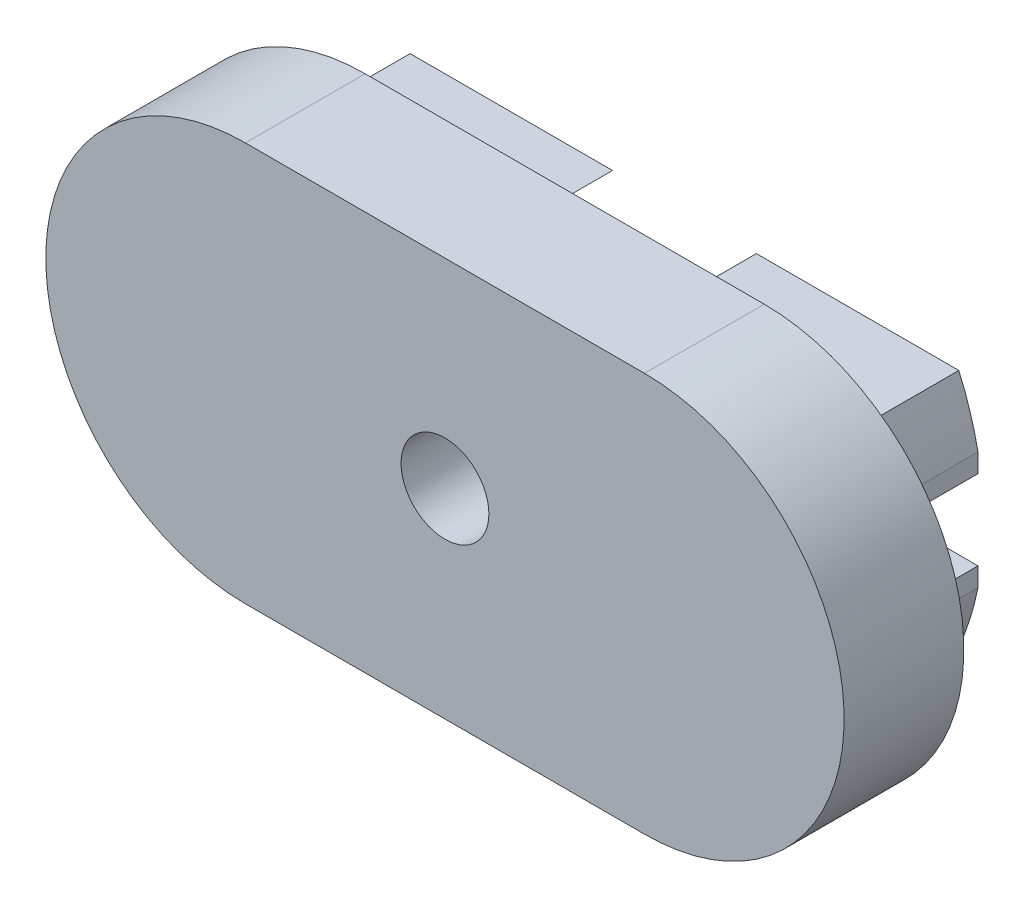
ISO-10303-21;
HEADER;
FILE_DESCRIPTION(('STEP AP214'),'2;1');
FILE_NAME('part.step','',(''),(''),'','','');
FILE_SCHEMA(('AUTOMOTIVE_DESIGN { 1 0 10303 214 1 1 1 1 }'));
ENDSEC;
DATA;
#1=APPLICATION_CONTEXT('core data for automotive mechanical design processes');
#2=APPLICATION_PROTOCOL_DEFINITION('international standard','automotive_design',2000,#1);
#3=PRODUCT_CONTEXT('',#1,'mechanical');
#4=PRODUCT('Part','Part','',(#3));
#5=PRODUCT_RELATED_PRODUCT_CATEGORY('part','',(#4));
#6=PRODUCT_DEFINITION_FORMATION('','',#4);
#7=PRODUCT_DEFINITION_CONTEXT('part definition',#1,'design');
#8=PRODUCT_DEFINITION('design','',#6,#7);
#9=PRODUCT_DEFINITION_SHAPE('','',#8);
#10=(LENGTH_UNIT() NAMED_UNIT(*) SI_UNIT(.MILLI.,.METRE.));
#11=(NAMED_UNIT(*) PLANE_ANGLE_UNIT() SI_UNIT($,.RADIAN.));
#12=(NAMED_UNIT(*) SI_UNIT($,.STERADIAN.) SOLID_ANGLE_UNIT());
#13=UNCERTAINTY_MEASURE_WITH_UNIT(LENGTH_MEASURE(1.E-05),#10,'distance_accuracy_value','');
#14=(GEOMETRIC_REPRESENTATION_CONTEXT(3) GLOBAL_UNCERTAINTY_ASSIGNED_CONTEXT((#13)) GLOBAL_UNIT_ASSIGNED_CONTEXT((#10,
#11,#12)) REPRESENTATION_CONTEXT('',''));
#15=CARTESIAN_POINT('',(0.,0.,0.));
#16=DIRECTION('',(0.,0.,1.));
#17=DIRECTION('',(1.,0.,0.));
#18=AXIS2_PLACEMENT_3D('',#15,#16,#17);
#19=CARTESIAN_POINT('',(-5.,0.,0.));
#20=DIRECTION('',(0.,0.,1.));
#21=DIRECTION('',(1.,0.,0.));
#22=AXIS2_PLACEMENT_3D('',#19,#20,#21);
#23=PLANE('',#22);
#24=CARTESIAN_POINT('',(0.,0.,0.));
#25=DIRECTION('',(0.,0.,-1.));
#26=DIRECTION('',(-1.,0.,0.));
#27=AXIS2_PLACEMENT_3D('',#24,#25,#26);
#28=CIRCLE('',#27,7.5);
#29=CARTESIAN_POINT('',(-7.35410196624968,1.47213595499958,0.));
#30=VERTEX_POINT('',#29);
#31=CARTESIAN_POINT('',(-6.87386354243376,3.,0.));
#32=VERTEX_POINT('',#31);
#33=EDGE_CURVE('E264',#30,#32,#28,.T.);
#34=ORIENTED_EDGE('',*,*,#33,.F.);
#35=DIRECTION('',(0.,1.,0.));
#36=VECTOR('',#35,1.);
#37=CARTESIAN_POINT('',(-7.35410196624968,1.47213595499958,0.));
#38=LINE('',#37,#36);
#39=CARTESIAN_POINT('',(-7.35410196624968,1.,0.));
#40=VERTEX_POINT('',#39);
#41=EDGE_CURVE('E251',#40,#30,#38,.T.);
#42=ORIENTED_EDGE('',*,*,#41,.F.);
#43=DIRECTION('',(-1.,0.,0.));
#44=VECTOR('',#43,1.);
#45=CARTESIAN_POINT('',(-3.35410196624968,1.,0.));
#46=LINE('',#45,#44);
#47=CARTESIAN_POINT('',(-3.35410196624968,1.,0.));
#48=VERTEX_POINT('',#47);
#49=EDGE_CURVE('E254',#48,#40,#46,.T.);
#50=ORIENTED_EDGE('',*,*,#49,.F.);
#51=CARTESIAN_POINT('',(0.,0.,0.));
#52=DIRECTION('',(0.,0.,1.));
#53=DIRECTION('',(1.,0.,0.));
#54=AXIS2_PLACEMENT_3D('',#51,#52,#53);
#55=CIRCLE('',#54,3.5);
#56=CARTESIAN_POINT('',(-1.80277563773199,3.,0.));
#57=VERTEX_POINT('',#56);
#58=EDGE_CURVE('E258',#57,#48,#55,.T.);
#59=ORIENTED_EDGE('',*,*,#58,.F.);
#60=DIRECTION('',(1.,0.,0.));
#61=VECTOR('',#60,1.);
#62=CARTESIAN_POINT('',(-1.80277563773199,3.,0.));
#63=LINE('',#62,#61);
#64=EDGE_CURVE('E261',#32,#57,#63,.T.);
#65=ORIENTED_EDGE('',*,*,#64,.F.);
#66=EDGE_LOOP('',(#34,#42,#50,#59,#65));
#67=FACE_BOUND('',#66,.T.);
#68=CARTESIAN_POINT('',(0.,0.,0.));
#69=DIRECTION('',(0.,0.,1.));
#70=DIRECTION('',(1.,0.,0.));
#71=AXIS2_PLACEMENT_3D('',#68,#69,#70);
#72=CIRCLE('',#71,3.5);
#73=CARTESIAN_POINT('',(1.80277563773199,-3.,0.));
#74=VERTEX_POINT('',#73);
#75=CARTESIAN_POINT('',(3.35410196624969,-0.999999999999999,0.));
#76=VERTEX_POINT('',#75);
#77=EDGE_CURVE('E308',#74,#76,#72,.T.);
#78=ORIENTED_EDGE('',*,*,#77,.F.);
#79=DIRECTION('',(-1.,0.,0.));
#80=VECTOR('',#79,1.);
#81=CARTESIAN_POINT('',(1.80277563773199,-3.,0.));
#82=LINE('',#81,#80);
#83=CARTESIAN_POINT('',(6.87386354243376,-3.,0.));
#84=VERTEX_POINT('',#83);
#85=EDGE_CURVE('E322',#84,#74,#82,.T.);
#86=ORIENTED_EDGE('',*,*,#85,.F.);
#87=CARTESIAN_POINT('',(0.,0.,0.));
#88=DIRECTION('',(0.,0.,-1.));
#89=DIRECTION('',(-1.,0.,0.));
#90=AXIS2_PLACEMENT_3D('',#87,#88,#89);
#91=CIRCLE('',#90,7.5);
#92=CARTESIAN_POINT('',(7.35410196624968,-1.47213595499958,0.));
#93=VERTEX_POINT('',#92);
#94=EDGE_CURVE('E339',#93,#84,#91,.T.);
#95=ORIENTED_EDGE('',*,*,#94,.F.);
#96=DIRECTION('',(0.,-1.,0.));
#97=VECTOR('',#96,1.);
#98=CARTESIAN_POINT('',(7.35410196624968,-1.47213595499958,0.));
#99=LINE('',#98,#97);
#100=CARTESIAN_POINT('',(7.35410196624968,-1.,0.));
#101=VERTEX_POINT('',#100);
#102=EDGE_CURVE('E336',#101,#93,#99,.T.);
#103=ORIENTED_EDGE('',*,*,#102,.F.);
#104=DIRECTION('',(1.,0.,0.));
#105=VECTOR('',#104,1.);
#106=CARTESIAN_POINT('',(3.35410196624968,-0.999999999999999,0.));
#107=LINE('',#106,#105);
#108=EDGE_CURVE('E333',#76,#101,#107,.T.);
#109=ORIENTED_EDGE('',*,*,#108,.F.);
#110=EDGE_LOOP('',(#78,#86,#95,#103,#109));
#111=FACE_BOUND('',#110,.T.);
#112=CARTESIAN_POINT('',(-5.,0.,0.));
#113=DIRECTION('',(0.,0.,1.));
#114=DIRECTION('',(1.,0.,0.));
#115=AXIS2_PLACEMENT_3D('',#112,#113,#114);
#116=CIRCLE('',#115,5.);
#117=CARTESIAN_POINT('',(-5.,5.,0.));
#118=VERTEX_POINT('',#117);
#119=CARTESIAN_POINT('',(-5.,-5.,0.));
#120=VERTEX_POINT('',#119);
#121=EDGE_CURVE('E362',#118,#120,#116,.T.);
#122=ORIENTED_EDGE('',*,*,#121,.F.);
#123=DIRECTION('',(-1.,0.,0.));
#124=VECTOR('',#123,1.);
#125=CARTESIAN_POINT('',(-5.,5.,0.));
#126=LINE('',#125,#124);
#127=CARTESIAN_POINT('',(5.,5.,0.));
#128=VERTEX_POINT('',#127);
#129=EDGE_CURVE('E369',#128,#118,#126,.T.);
#130=ORIENTED_EDGE('',*,*,#129,.F.);
#131=CARTESIAN_POINT('',(5.,0.,0.));
#132=DIRECTION('',(0.,0.,1.));
#133=DIRECTION('',(1.,0.,0.));
#134=AXIS2_PLACEMENT_3D('',#131,#132,#133);
#135=CIRCLE('',#134,5.);
#136=CARTESIAN_POINT('',(5.,-5.,0.));
#137=VERTEX_POINT('',#136);
#138=EDGE_CURVE('E380',#137,#128,#135,.T.);
#139=ORIENTED_EDGE('',*,*,#138,.F.);
#140=DIRECTION('',(1.,0.,0.));
#141=VECTOR('',#140,1.);
#142=CARTESIAN_POINT('',(-5.,-5.,0.));
#143=LINE('',#142,#141);
#144=EDGE_CURVE('E378',#120,#137,#143,.T.);
#145=ORIENTED_EDGE('',*,*,#144,.F.);
#146=EDGE_LOOP('',(#122,#130,#139,#145));
#147=FACE_BOUND('',#146,.T.);
#148=CARTESIAN_POINT('',(0.,0.,0.));
#149=DIRECTION('',(0.,0.,1.));
#150=DIRECTION('',(1.,0.,0.));
#151=AXIS2_PLACEMENT_3D('',#148,#149,#150);
#152=CIRCLE('',#151,1.1);
#153=CARTESIAN_POINT('',(1.1,0.,0.));
#154=VERTEX_POINT('',#153);
#155=EDGE_CURVE('E358',#154,#154,#152,.T.);
#156=ORIENTED_EDGE('',*,*,#155,.T.);
#157=EDGE_LOOP('',(#156));
#158=FACE_BOUND('',#157,.T.);
#159=CARTESIAN_POINT('',(0.,0.,0.));
#160=DIRECTION('',(0.,0.,1.));
#161=DIRECTION('',(-1.,0.,0.));
#162=AXIS2_PLACEMENT_3D('',#159,#160,#161);
#163=CIRCLE('',#162,3.5);
#164=CARTESIAN_POINT('',(3.35410196624968,1.,0.));
#165=VERTEX_POINT('',#164);
#166=CARTESIAN_POINT('',(1.80277563773199,3.,0.));
#167=VERTEX_POINT('',#166);
#168=EDGE_CURVE('E305',#165,#167,#163,.T.);
#169=ORIENTED_EDGE('',*,*,#168,.F.);
#170=DIRECTION('',(-1.,0.,0.));
#171=VECTOR('',#170,1.);
#172=CARTESIAN_POINT('',(3.35410196624968,1.,0.));
#173=LINE('',#172,#171);
#174=CARTESIAN_POINT('',(7.35410196624969,1.,0.));
#175=VERTEX_POINT('',#174);
#176=EDGE_CURVE('E292',#175,#165,#173,.T.);
#177=ORIENTED_EDGE('',*,*,#176,.F.);
#178=DIRECTION('',(0.,-1.,0.));
#179=VECTOR('',#178,1.);
#180=CARTESIAN_POINT('',(7.35410196624968,1.47213595499958,0.));
#181=LINE('',#180,#179);
#182=CARTESIAN_POINT('',(7.35410196624968,1.47213595499958,0.));
#183=VERTEX_POINT('',#182);
#184=EDGE_CURVE('E295',#183,#175,#181,.T.);
#185=ORIENTED_EDGE('',*,*,#184,.F.);
#186=CARTESIAN_POINT('',(0.,0.,0.));
#187=DIRECTION('',(0.,0.,-1.));
#188=DIRECTION('',(-1.,0.,0.));
#189=AXIS2_PLACEMENT_3D('',#186,#187,#188);
#190=CIRCLE('',#189,7.5);
#191=CARTESIAN_POINT('',(6.87386354243376,3.,0.));
#192=VERTEX_POINT('',#191);
#193=EDGE_CURVE('E299',#192,#183,#190,.T.);
#194=ORIENTED_EDGE('',*,*,#193,.F.);
#195=DIRECTION('',(1.,0.,0.));
#196=VECTOR('',#195,1.);
#197=CARTESIAN_POINT('',(1.80277563773199,3.,0.));
#198=LINE('',#197,#196);
#199=EDGE_CURVE('E302',#167,#192,#198,.T.);
#200=ORIENTED_EDGE('',*,*,#199,.F.);
#201=EDGE_LOOP('',(#169,#177,#185,#194,#200));
#202=FACE_BOUND('',#201,.T.);
#203=CARTESIAN_POINT('',(0.,0.,0.));
#204=DIRECTION('',(0.,0.,-1.));
#205=DIRECTION('',(-1.,0.,0.));
#206=AXIS2_PLACEMENT_3D('',#203,#204,#205);
#207=CIRCLE('',#206,7.5);
#208=CARTESIAN_POINT('',(-6.87386354243376,-3.,0.));
#209=VERTEX_POINT('',#208);
#210=CARTESIAN_POINT('',(-7.35410196624968,-1.47213595499958,0.));
#211=VERTEX_POINT('',#210);
#212=EDGE_CURVE('E196',#209,#211,#207,.T.);
#213=ORIENTED_EDGE('',*,*,#212,.F.);
#214=DIRECTION('',(-1.,0.,0.));
#215=VECTOR('',#214,1.);
#216=CARTESIAN_POINT('',(-1.802775637732,-3.,0.));
#217=LINE('',#216,#215);
#218=CARTESIAN_POINT('',(-1.802775637732,-3.,0.));
#219=VERTEX_POINT('',#218);
#220=EDGE_CURVE('E198',#219,#209,#217,.T.);
#221=ORIENTED_EDGE('',*,*,#220,.F.);
#222=CARTESIAN_POINT('',(0.,0.,0.));
#223=DIRECTION('',(0.,0.,1.));
#224=DIRECTION('',(-1.,0.,0.));
#225=AXIS2_PLACEMENT_3D('',#222,#223,#224);
#226=CIRCLE('',#225,3.5);
#227=CARTESIAN_POINT('',(-3.35410196624969,-0.999999999999997,0.));
#228=VERTEX_POINT('',#227);
#229=EDGE_CURVE('E214',#228,#219,#226,.T.);
#230=ORIENTED_EDGE('',*,*,#229,.F.);
#231=DIRECTION('',(1.,0.,0.));
#232=VECTOR('',#231,1.);
#233=CARTESIAN_POINT('',(-3.35410196624969,-0.999999999999997,0.));
#234=LINE('',#233,#232);
#235=CARTESIAN_POINT('',(-7.35410196624968,-0.999999999999996,0.));
#236=VERTEX_POINT('',#235);
#237=EDGE_CURVE('E59',#236,#228,#234,.T.);
#238=ORIENTED_EDGE('',*,*,#237,.F.);
#239=DIRECTION('',(0.,1.,0.));
#240=VECTOR('',#239,1.);
#241=CARTESIAN_POINT('',(-7.35410196624968,-1.47213595499958,0.));
#242=LINE('',#241,#240);
#243=EDGE_CURVE('E54',#211,#236,#242,.T.);
#244=ORIENTED_EDGE('',*,*,#243,.F.);
#245=EDGE_LOOP('',(#213,#221,#230,#238,#244));
#246=FACE_BOUND('',#245,.T.);
#247=ADVANCED_FACE('F39',(#67,#111,#147,#158,#202,#246),#23,.F.);
#248=CARTESIAN_POINT('',(-5.,0.,3.));
#249=DIRECTION('',(0.,0.,1.));
#250=DIRECTION('',(1.,0.,0.));
#251=AXIS2_PLACEMENT_3D('',#248,#249,#250);
#252=PLANE('',#251);
#253=CARTESIAN_POINT('',(-5.,0.,3.));
#254=DIRECTION('',(0.,0.,1.));
#255=DIRECTION('',(1.,0.,0.));
#256=AXIS2_PLACEMENT_3D('',#253,#254,#255);
#257=CIRCLE('',#256,5.);
#258=CARTESIAN_POINT('',(-5.,5.,3.));
#259=VERTEX_POINT('',#258);
#260=CARTESIAN_POINT('',(-5.,-5.,3.));
#261=VERTEX_POINT('',#260);
#262=EDGE_CURVE('E365',#259,#261,#257,.T.);
#263=ORIENTED_EDGE('',*,*,#262,.T.);
#264=DIRECTION('',(1.,0.,0.));
#265=VECTOR('',#264,1.);
#266=CARTESIAN_POINT('',(-5.,-5.,3.));
#267=LINE('',#266,#265);
#268=CARTESIAN_POINT('',(5.,-5.,3.));
#269=VERTEX_POINT('',#268);
#270=EDGE_CURVE('E368',#261,#269,#267,.T.);
#271=ORIENTED_EDGE('',*,*,#270,.T.);
#272=CARTESIAN_POINT('',(5.,0.,3.));
#273=DIRECTION('',(0.,0.,1.));
#274=DIRECTION('',(1.,0.,0.));
#275=AXIS2_PLACEMENT_3D('',#272,#273,#274);
#276=CIRCLE('',#275,5.);
#277=CARTESIAN_POINT('',(5.,5.,3.));
#278=VERTEX_POINT('',#277);
#279=EDGE_CURVE('E371',#269,#278,#276,.T.);
#280=ORIENTED_EDGE('',*,*,#279,.T.);
#281=DIRECTION('',(-1.,0.,0.));
#282=VECTOR('',#281,1.);
#283=CARTESIAN_POINT('',(-5.,5.,3.));
#284=LINE('',#283,#282);
#285=EDGE_CURVE('E373',#278,#259,#284,.T.);
#286=ORIENTED_EDGE('',*,*,#285,.T.);
#287=EDGE_LOOP('',(#263,#271,#280,#286));
#288=FACE_BOUND('',#287,.T.);
#289=CARTESIAN_POINT('',(0.,0.,3.));
#290=DIRECTION('',(0.,0.,1.));
#291=DIRECTION('',(1.,0.,0.));
#292=AXIS2_PLACEMENT_3D('',#289,#290,#291);
#293=CIRCLE('',#292,1.1);
#294=CARTESIAN_POINT('',(1.1,0.,3.));
#295=VERTEX_POINT('',#294);
#296=EDGE_CURVE('E359',#295,#295,#293,.T.);
#297=ORIENTED_EDGE('',*,*,#296,.F.);
#298=EDGE_LOOP('',(#297));
#299=FACE_BOUND('',#298,.T.);
#300=ADVANCED_FACE('F407',(#288,#299),#252,.T.);
#301=CARTESIAN_POINT('',(-5.,0.,3.));
#302=DIRECTION('',(0.,0.,-1.));
#303=DIRECTION('',(-1.,0.,0.));
#304=AXIS2_PLACEMENT_3D('',#301,#302,#303);
#305=CYLINDRICAL_SURFACE('',#304,5.);
#306=ORIENTED_EDGE('',*,*,#121,.T.);
#307=DIRECTION('',(0.,0.,-1.));
#308=VECTOR('',#307,1.);
#309=CARTESIAN_POINT('',(-5.,-5.,3.));
#310=LINE('',#309,#308);
#311=EDGE_CURVE('E11',#261,#120,#310,.T.);
#312=ORIENTED_EDGE('',*,*,#311,.F.);
#313=ORIENTED_EDGE('',*,*,#262,.F.);
#314=DIRECTION('',(0.,0.,-1.));
#315=VECTOR('',#314,1.);
#316=CARTESIAN_POINT('',(-5.,5.,3.));
#317=LINE('',#316,#315);
#318=EDGE_CURVE('E375',#259,#118,#317,.T.);
#319=ORIENTED_EDGE('',*,*,#318,.T.);
#320=EDGE_LOOP('',(#306,#312,#313,#319));
#321=FACE_BOUND('',#320,.T.);
#322=ADVANCED_FACE('F41',(#321),#305,.T.);
#323=CARTESIAN_POINT('',(-5.,-5.,3.));
#324=DIRECTION('',(0.,1.,0.));
#325=DIRECTION('',(-1.,0.,0.));
#326=AXIS2_PLACEMENT_3D('',#323,#324,#325);
#327=PLANE('',#326);
#328=ORIENTED_EDGE('',*,*,#144,.T.);
#329=DIRECTION('',(0.,0.,-1.));
#330=VECTOR('',#329,1.);
#331=CARTESIAN_POINT('',(5.,-5.,3.));
#332=LINE('',#331,#330);
#333=EDGE_CURVE('E47',#269,#137,#332,.T.);
#334=ORIENTED_EDGE('',*,*,#333,.F.);
#335=ORIENTED_EDGE('',*,*,#270,.F.);
#336=ORIENTED_EDGE('',*,*,#311,.T.);
#337=EDGE_LOOP('',(#328,#334,#335,#336));
#338=FACE_BOUND('',#337,.T.);
#339=ADVANCED_FACE('F409',(#338),#327,.F.);
#340=CARTESIAN_POINT('',(5.,0.,3.));
#341=DIRECTION('',(0.,0.,-1.));
#342=DIRECTION('',(-1.,0.,0.));
#343=AXIS2_PLACEMENT_3D('',#340,#341,#342);
#344=CYLINDRICAL_SURFACE('',#343,5.);
#345=ORIENTED_EDGE('',*,*,#138,.T.);
#346=DIRECTION('',(0.,0.,-1.));
#347=VECTOR('',#346,1.);
#348=CARTESIAN_POINT('',(5.,5.,3.));
#349=LINE('',#348,#347);
#350=EDGE_CURVE('E385',#278,#128,#349,.T.);
#351=ORIENTED_EDGE('',*,*,#350,.F.);
#352=ORIENTED_EDGE('',*,*,#279,.F.);
#353=ORIENTED_EDGE('',*,*,#333,.T.);
#354=EDGE_LOOP('',(#345,#351,#352,#353));
#355=FACE_BOUND('',#354,.T.);
#356=ADVANCED_FACE('F392',(#355),#344,.T.);
#357=CARTESIAN_POINT('',(-5.,5.,3.));
#358=DIRECTION('',(0.,-1.,0.));
#359=DIRECTION('',(1.,0.,0.));
#360=AXIS2_PLACEMENT_3D('',#357,#358,#359);
#361=PLANE('',#360);
#362=ORIENTED_EDGE('',*,*,#129,.T.);
#363=ORIENTED_EDGE('',*,*,#318,.F.);
#364=ORIENTED_EDGE('',*,*,#285,.F.);
#365=ORIENTED_EDGE('',*,*,#350,.T.);
#366=EDGE_LOOP('',(#362,#363,#364,#365));
#367=FACE_BOUND('',#366,.T.);
#368=ADVANCED_FACE('F401',(#367),#361,.F.);
#369=CARTESIAN_POINT('',(0.,0.,3.));
#370=DIRECTION('',(0.,0.,-1.));
#371=DIRECTION('',(-1.,0.,0.));
#372=AXIS2_PLACEMENT_3D('',#369,#370,#371);
#373=CYLINDRICAL_SURFACE('',#372,1.1);
#374=ORIENTED_EDGE('',*,*,#296,.T.);
#375=EDGE_LOOP('',(#374));
#376=FACE_BOUND('',#375,.T.);
#377=ORIENTED_EDGE('',*,*,#155,.F.);
#378=EDGE_LOOP('',(#377));
#379=FACE_BOUND('',#378,.T.);
#380=ADVANCED_FACE('F427',(#376,#379),#373,.F.);
#381=CARTESIAN_POINT('',(0.,0.,-3.));
#382=DIRECTION('',(0.,0.,1.));
#383=DIRECTION('',(1.,0.,0.));
#384=AXIS2_PLACEMENT_3D('',#381,#382,#383);
#385=CYLINDRICAL_SURFACE('',#384,3.5);
#386=ORIENTED_EDGE('',*,*,#77,.T.);
#387=DIRECTION('',(0.,0.,1.));
#388=VECTOR('',#387,1.);
#389=CARTESIAN_POINT('',(3.35410196624968,-0.999999999999999,-3.));
#390=LINE('',#389,#388);
#391=CARTESIAN_POINT('',(3.35410196624968,-0.999999999999999,-3.));
#392=VERTEX_POINT('',#391);
#393=EDGE_CURVE('E355',#392,#76,#390,.T.);
#394=ORIENTED_EDGE('',*,*,#393,.F.);
#395=CARTESIAN_POINT('',(0.,0.,-3.));
#396=DIRECTION('',(0.,0.,1.));
#397=DIRECTION('',(1.,0.,0.));
#398=AXIS2_PLACEMENT_3D('',#395,#396,#397);
#399=CIRCLE('',#398,3.5);
#400=CARTESIAN_POINT('',(1.80277563773199,-3.,-3.));
#401=VERTEX_POINT('',#400);
#402=EDGE_CURVE('E318',#401,#392,#399,.T.);
#403=ORIENTED_EDGE('',*,*,#402,.F.);
#404=DIRECTION('',(0.,0.,1.));
#405=VECTOR('',#404,1.);
#406=CARTESIAN_POINT('',(1.80277563773199,-3.,-3.));
#407=LINE('',#406,#405);
#408=EDGE_CURVE('E330',#401,#74,#407,.T.);
#409=ORIENTED_EDGE('',*,*,#408,.T.);
#410=EDGE_LOOP('',(#386,#394,#403,#409));
#411=FACE_BOUND('',#410,.T.);
#412=ADVANCED_FACE('F431',(#411),#385,.F.);
#413=CARTESIAN_POINT('',(3.35410196624968,-0.999999999999999,-3.));
#414=DIRECTION('',(0.,-1.,0.));
#415=DIRECTION('',(1.,0.,0.));
#416=AXIS2_PLACEMENT_3D('',#413,#414,#415);
#417=PLANE('',#416);
#418=ORIENTED_EDGE('',*,*,#108,.T.);
#419=DIRECTION('',(0.,0.,1.));
#420=VECTOR('',#419,1.);
#421=CARTESIAN_POINT('',(7.35410196624968,-1.,-3.));
#422=LINE('',#421,#420);
#423=CARTESIAN_POINT('',(7.35410196624968,-1.,-3.));
#424=VERTEX_POINT('',#423);
#425=EDGE_CURVE('E352',#424,#101,#422,.T.);
#426=ORIENTED_EDGE('',*,*,#425,.F.);
#427=DIRECTION('',(1.,0.,0.));
#428=VECTOR('',#427,1.);
#429=CARTESIAN_POINT('',(3.35410196624968,-0.999999999999999,-3.));
#430=LINE('',#429,#428);
#431=EDGE_CURVE('E321',#392,#424,#430,.T.);
#432=ORIENTED_EDGE('',*,*,#431,.F.);
#433=ORIENTED_EDGE('',*,*,#393,.T.);
#434=EDGE_LOOP('',(#418,#426,#432,#433));
#435=FACE_BOUND('',#434,.T.);
#436=ADVANCED_FACE('F436',(#435),#417,.F.);
#437=CARTESIAN_POINT('',(7.35410196624968,-1.47213595499958,-3.));
#438=DIRECTION('',(-1.,0.,0.));
#439=DIRECTION('',(0.,0.,1.));
#440=AXIS2_PLACEMENT_3D('',#437,#438,#439);
#441=PLANE('',#440);
#442=ORIENTED_EDGE('',*,*,#102,.T.);
#443=DIRECTION('',(0.,0.,1.));
#444=VECTOR('',#443,1.);
#445=CARTESIAN_POINT('',(7.35410196624968,-1.47213595499958,-3.));
#446=LINE('',#445,#444);
#447=CARTESIAN_POINT('',(7.35410196624968,-1.47213595499958,-3.));
#448=VERTEX_POINT('',#447);
#449=EDGE_CURVE('E349',#448,#93,#446,.T.);
#450=ORIENTED_EDGE('',*,*,#449,.F.);
#451=DIRECTION('',(0.,-1.,0.));
#452=VECTOR('',#451,1.);
#453=CARTESIAN_POINT('',(7.35410196624968,-1.47213595499958,-3.));
#454=LINE('',#453,#452);
#455=EDGE_CURVE('E324',#424,#448,#454,.T.);
#456=ORIENTED_EDGE('',*,*,#455,.F.);
#457=ORIENTED_EDGE('',*,*,#425,.T.);
#458=EDGE_LOOP('',(#442,#450,#456,#457));
#459=FACE_BOUND('',#458,.T.);
#460=ADVANCED_FACE('F443',(#459),#441,.F.);
#461=CARTESIAN_POINT('',(0.,0.,-3.));
#462=DIRECTION('',(0.,0.,1.));
#463=DIRECTION('',(1.,0.,0.));
#464=AXIS2_PLACEMENT_3D('',#461,#462,#463);
#465=CYLINDRICAL_SURFACE('',#464,7.5);
#466=ORIENTED_EDGE('',*,*,#94,.T.);
#467=DIRECTION('',(0.,0.,1.));
#468=VECTOR('',#467,1.);
#469=CARTESIAN_POINT('',(6.87386354243376,-3.,-3.));
#470=LINE('',#469,#468);
#471=CARTESIAN_POINT('',(6.87386354243376,-3.,-3.));
#472=VERTEX_POINT('',#471);
#473=EDGE_CURVE('E346',#472,#84,#470,.T.);
#474=ORIENTED_EDGE('',*,*,#473,.F.);
#475=CARTESIAN_POINT('',(0.,0.,-3.));
#476=DIRECTION('',(0.,0.,-1.));
#477=DIRECTION('',(-1.,0.,0.));
#478=AXIS2_PLACEMENT_3D('',#475,#476,#477);
#479=CIRCLE('',#478,7.5);
#480=EDGE_CURVE('E326',#448,#472,#479,.T.);
#481=ORIENTED_EDGE('',*,*,#480,.F.);
#482=ORIENTED_EDGE('',*,*,#449,.T.);
#483=EDGE_LOOP('',(#466,#474,#481,#482));
#484=FACE_BOUND('',#483,.T.);
#485=ADVANCED_FACE('F447',(#484),#465,.T.);
#486=CARTESIAN_POINT('',(1.80277563773199,-3.,-3.));
#487=DIRECTION('',(0.,1.,0.));
#488=DIRECTION('',(-1.,0.,0.));
#489=AXIS2_PLACEMENT_3D('',#486,#487,#488);
#490=PLANE('',#489);
#491=ORIENTED_EDGE('',*,*,#85,.T.);
#492=ORIENTED_EDGE('',*,*,#408,.F.);
#493=DIRECTION('',(-1.,0.,0.));
#494=VECTOR('',#493,1.);
#495=CARTESIAN_POINT('',(1.80277563773199,-3.,-3.));
#496=LINE('',#495,#494);
#497=EDGE_CURVE('E328',#472,#401,#496,.T.);
#498=ORIENTED_EDGE('',*,*,#497,.F.);
#499=ORIENTED_EDGE('',*,*,#473,.T.);
#500=EDGE_LOOP('',(#491,#492,#498,#499));
#501=FACE_BOUND('',#500,.T.);
#502=ADVANCED_FACE('F451',(#501),#490,.F.);
#503=CARTESIAN_POINT('',(0.,0.,-3.));
#504=DIRECTION('',(0.,0.,1.));
#505=DIRECTION('',(1.,0.,0.));
#506=AXIS2_PLACEMENT_3D('',#503,#504,#505);
#507=PLANE('',#506);
#508=ORIENTED_EDGE('',*,*,#402,.T.);
#509=ORIENTED_EDGE('',*,*,#431,.T.);
#510=ORIENTED_EDGE('',*,*,#455,.T.);
#511=ORIENTED_EDGE('',*,*,#480,.T.);
#512=ORIENTED_EDGE('',*,*,#497,.T.);
#513=EDGE_LOOP('',(#508,#509,#510,#511,#512));
#514=FACE_BOUND('',#513,.T.);
#515=ADVANCED_FACE('F455',(#514),#507,.F.);
#516=CARTESIAN_POINT('',(0.,0.,-3.));
#517=DIRECTION('',(0.,0.,1.));
#518=DIRECTION('',(1.,0.,0.));
#519=AXIS2_PLACEMENT_3D('',#516,#517,#518);
#520=CYLINDRICAL_SURFACE('',#519,3.5);
#521=ORIENTED_EDGE('',*,*,#168,.T.);
#522=DIRECTION('',(0.,0.,1.));
#523=VECTOR('',#522,1.);
#524=CARTESIAN_POINT('',(1.80277563773199,3.,-3.));
#525=LINE('',#524,#523);
#526=CARTESIAN_POINT('',(1.80277563773199,3.,-3.));
#527=VERTEX_POINT('',#526);
#528=EDGE_CURVE('E267',#527,#167,#525,.T.);
#529=ORIENTED_EDGE('',*,*,#528,.F.);
#530=CARTESIAN_POINT('',(0.,0.,-3.));
#531=DIRECTION('',(0.,0.,1.));
#532=DIRECTION('',(-1.,0.,0.));
#533=AXIS2_PLACEMENT_3D('',#530,#531,#532);
#534=CIRCLE('',#533,3.5);
#535=CARTESIAN_POINT('',(3.35410196624968,1.,-3.));
#536=VERTEX_POINT('',#535);
#537=EDGE_CURVE('E296',#536,#527,#534,.T.);
#538=ORIENTED_EDGE('',*,*,#537,.F.);
#539=DIRECTION('',(0.,0.,1.));
#540=VECTOR('',#539,1.);
#541=CARTESIAN_POINT('',(3.35410196624968,1.,-3.));
#542=LINE('',#541,#540);
#543=EDGE_CURVE('E288',#536,#165,#542,.T.);
#544=ORIENTED_EDGE('',*,*,#543,.T.);
#545=EDGE_LOOP('',(#521,#529,#538,#544));
#546=FACE_BOUND('',#545,.T.);
#547=ADVANCED_FACE('F459',(#546),#520,.F.);
#548=CARTESIAN_POINT('',(1.80277563773199,3.,-3.));
#549=DIRECTION('',(0.,-1.,0.));
#550=DIRECTION('',(1.,0.,0.));
#551=AXIS2_PLACEMENT_3D('',#548,#549,#550);
#552=PLANE('',#551);
#553=ORIENTED_EDGE('',*,*,#199,.T.);
#554=DIRECTION('',(0.,0.,1.));
#555=VECTOR('',#554,1.);
#556=CARTESIAN_POINT('',(6.87386354243376,3.,-3.));
#557=LINE('',#556,#555);
#558=CARTESIAN_POINT('',(6.87386354243376,3.,-3.));
#559=VERTEX_POINT('',#558);
#560=EDGE_CURVE('E279',#559,#192,#557,.T.);
#561=ORIENTED_EDGE('',*,*,#560,.F.);
#562=DIRECTION('',(1.,0.,0.));
#563=VECTOR('',#562,1.);
#564=CARTESIAN_POINT('',(1.80277563773199,3.,-3.));
#565=LINE('',#564,#563);
#566=EDGE_CURVE('E314',#527,#559,#565,.T.);
#567=ORIENTED_EDGE('',*,*,#566,.F.);
#568=ORIENTED_EDGE('',*,*,#528,.T.);
#569=EDGE_LOOP('',(#553,#561,#567,#568));
#570=FACE_BOUND('',#569,.T.);
#571=ADVANCED_FACE('F477',(#570),#552,.F.);
#572=CARTESIAN_POINT('',(0.,0.,-3.));
#573=DIRECTION('',(0.,0.,1.));
#574=DIRECTION('',(1.,0.,0.));
#575=AXIS2_PLACEMENT_3D('',#572,#573,#574);
#576=CYLINDRICAL_SURFACE('',#575,7.5);
#577=ORIENTED_EDGE('',*,*,#193,.T.);
#578=DIRECTION('',(0.,0.,1.));
#579=VECTOR('',#578,1.);
#580=CARTESIAN_POINT('',(7.35410196624968,1.47213595499958,-3.));
#581=LINE('',#580,#579);
#582=CARTESIAN_POINT('',(7.35410196624968,1.47213595499958,-3.));
#583=VERTEX_POINT('',#582);
#584=EDGE_CURVE('E282',#583,#183,#581,.T.);
#585=ORIENTED_EDGE('',*,*,#584,.F.);
#586=CARTESIAN_POINT('',(0.,0.,-3.));
#587=DIRECTION('',(0.,0.,-1.));
#588=DIRECTION('',(-1.,0.,0.));
#589=AXIS2_PLACEMENT_3D('',#586,#587,#588);
#590=CIRCLE('',#589,7.5);
#591=EDGE_CURVE('E312',#559,#583,#590,.T.);
#592=ORIENTED_EDGE('',*,*,#591,.F.);
#593=ORIENTED_EDGE('',*,*,#560,.T.);
#594=EDGE_LOOP('',(#577,#585,#592,#593));
#595=FACE_BOUND('',#594,.T.);
#596=ADVANCED_FACE('F473',(#595),#576,.T.);
#597=CARTESIAN_POINT('',(7.35410196624968,1.47213595499958,-3.));
#598=DIRECTION('',(-1.,0.,0.));
#599=DIRECTION('',(0.,0.,1.));
#600=AXIS2_PLACEMENT_3D('',#597,#598,#599);
#601=PLANE('',#600);
#602=ORIENTED_EDGE('',*,*,#184,.T.);
#603=DIRECTION('',(0.,0.,1.));
#604=VECTOR('',#603,1.);
#605=CARTESIAN_POINT('',(7.35410196624968,1.,-3.));
#606=LINE('',#605,#604);
#607=CARTESIAN_POINT('',(7.35410196624968,1.,-3.));
#608=VERTEX_POINT('',#607);
#609=EDGE_CURVE('E285',#608,#175,#606,.T.);
#610=ORIENTED_EDGE('',*,*,#609,.F.);
#611=DIRECTION('',(0.,-1.,0.));
#612=VECTOR('',#611,1.);
#613=CARTESIAN_POINT('',(7.35410196624968,1.47213595499958,-3.));
#614=LINE('',#613,#612);
#615=EDGE_CURVE('E310',#583,#608,#614,.T.);
#616=ORIENTED_EDGE('',*,*,#615,.F.);
#617=ORIENTED_EDGE('',*,*,#584,.T.);
#618=EDGE_LOOP('',(#602,#610,#616,#617));
#619=FACE_BOUND('',#618,.T.);
#620=ADVANCED_FACE('F469',(#619),#601,.F.);
#621=CARTESIAN_POINT('',(3.35410196624968,1.,-3.));
#622=DIRECTION('',(0.,1.,0.));
#623=DIRECTION('',(-1.,0.,0.));
#624=AXIS2_PLACEMENT_3D('',#621,#622,#623);
#625=PLANE('',#624);
#626=ORIENTED_EDGE('',*,*,#176,.T.);
#627=ORIENTED_EDGE('',*,*,#543,.F.);
#628=DIRECTION('',(-1.,0.,0.));
#629=VECTOR('',#628,1.);
#630=CARTESIAN_POINT('',(3.35410196624968,1.,-3.));
#631=LINE('',#630,#629);
#632=EDGE_CURVE('E291',#608,#536,#631,.T.);
#633=ORIENTED_EDGE('',*,*,#632,.F.);
#634=ORIENTED_EDGE('',*,*,#609,.T.);
#635=EDGE_LOOP('',(#626,#627,#633,#634));
#636=FACE_BOUND('',#635,.T.);
#637=ADVANCED_FACE('F465',(#636),#625,.F.);
#638=CARTESIAN_POINT('',(0.,0.,-3.));
#639=DIRECTION('',(0.,0.,-1.));
#640=DIRECTION('',(-1.,0.,0.));
#641=AXIS2_PLACEMENT_3D('',#638,#639,#640);
#642=PLANE('',#641);
#643=ORIENTED_EDGE('',*,*,#537,.T.);
#644=ORIENTED_EDGE('',*,*,#566,.T.);
#645=ORIENTED_EDGE('',*,*,#591,.T.);
#646=ORIENTED_EDGE('',*,*,#615,.T.);
#647=ORIENTED_EDGE('',*,*,#632,.T.);
#648=EDGE_LOOP('',(#643,#644,#645,#646,#647));
#649=FACE_BOUND('',#648,.T.);
#650=ADVANCED_FACE('F461',(#649),#642,.T.);
#651=CARTESIAN_POINT('',(0.,0.,-3.));
#652=DIRECTION('',(0.,0.,1.));
#653=DIRECTION('',(1.,0.,0.));
#654=AXIS2_PLACEMENT_3D('',#651,#652,#653);
#655=CYLINDRICAL_SURFACE('',#654,7.5);
#656=ORIENTED_EDGE('',*,*,#33,.T.);
#657=DIRECTION('',(0.,0.,1.));
#658=VECTOR('',#657,1.);
#659=CARTESIAN_POINT('',(-6.87386354243376,3.,-3.));
#660=LINE('',#659,#658);
#661=CARTESIAN_POINT('',(-6.87386354243376,3.,-3.));
#662=VERTEX_POINT('',#661);
#663=EDGE_CURVE('E203',#662,#32,#660,.T.);
#664=ORIENTED_EDGE('',*,*,#663,.F.);
#665=CARTESIAN_POINT('',(0.,0.,-3.));
#666=DIRECTION('',(0.,0.,-1.));
#667=DIRECTION('',(-1.,0.,0.));
#668=AXIS2_PLACEMENT_3D('',#665,#666,#667);
#669=CIRCLE('',#668,7.5);
#670=CARTESIAN_POINT('',(-7.35410196624968,1.47213595499958,-3.));
#671=VERTEX_POINT('',#670);
#672=EDGE_CURVE('E255',#671,#662,#669,.T.);
#673=ORIENTED_EDGE('',*,*,#672,.F.);
#674=DIRECTION('',(0.,0.,1.));
#675=VECTOR('',#674,1.);
#676=CARTESIAN_POINT('',(-7.35410196624968,1.47213595499958,-3.));
#677=LINE('',#676,#675);
#678=EDGE_CURVE('E247',#671,#30,#677,.T.);
#679=ORIENTED_EDGE('',*,*,#678,.T.);
#680=EDGE_LOOP('',(#656,#664,#673,#679));
#681=FACE_BOUND('',#680,.T.);
#682=ADVANCED_FACE('F464',(#681),#655,.T.);
#683=CARTESIAN_POINT('',(-1.80277563773199,3.,-3.));
#684=DIRECTION('',(0.,-1.,0.));
#685=DIRECTION('',(1.,0.,0.));
#686=AXIS2_PLACEMENT_3D('',#683,#684,#685);
#687=PLANE('',#686);
#688=ORIENTED_EDGE('',*,*,#64,.T.);
#689=DIRECTION('',(0.,0.,1.));
#690=VECTOR('',#689,1.);
#691=CARTESIAN_POINT('',(-1.80277563773199,3.,-3.));
#692=LINE('',#691,#690);
#693=CARTESIAN_POINT('',(-1.80277563773199,3.,-3.));
#694=VERTEX_POINT('',#693);
#695=EDGE_CURVE('E238',#694,#57,#692,.T.);
#696=ORIENTED_EDGE('',*,*,#695,.F.);
#697=DIRECTION('',(1.,0.,0.));
#698=VECTOR('',#697,1.);
#699=CARTESIAN_POINT('',(-1.80277563773199,3.,-3.));
#700=LINE('',#699,#698);
#701=EDGE_CURVE('E273',#662,#694,#700,.T.);
#702=ORIENTED_EDGE('',*,*,#701,.F.);
#703=ORIENTED_EDGE('',*,*,#663,.T.);
#704=EDGE_LOOP('',(#688,#696,#702,#703));
#705=FACE_BOUND('',#704,.T.);
#706=ADVANCED_FACE('F500',(#705),#687,.F.);
#707=CARTESIAN_POINT('',(0.,0.,-3.));
#708=DIRECTION('',(0.,0.,1.));
#709=DIRECTION('',(1.,0.,0.));
#710=AXIS2_PLACEMENT_3D('',#707,#708,#709);
#711=CYLINDRICAL_SURFACE('',#710,3.5);
#712=ORIENTED_EDGE('',*,*,#58,.T.);
#713=DIRECTION('',(0.,0.,1.));
#714=VECTOR('',#713,1.);
#715=CARTESIAN_POINT('',(-3.35410196624968,1.,-3.));
#716=LINE('',#715,#714);
#717=CARTESIAN_POINT('',(-3.35410196624968,1.,-3.));
#718=VERTEX_POINT('',#717);
#719=EDGE_CURVE('E241',#718,#48,#716,.T.);
#720=ORIENTED_EDGE('',*,*,#719,.F.);
#721=CARTESIAN_POINT('',(0.,0.,-3.));
#722=DIRECTION('',(0.,0.,1.));
#723=DIRECTION('',(1.,0.,0.));
#724=AXIS2_PLACEMENT_3D('',#721,#722,#723);
#725=CIRCLE('',#724,3.5);
#726=EDGE_CURVE('E271',#694,#718,#725,.T.);
#727=ORIENTED_EDGE('',*,*,#726,.F.);
#728=ORIENTED_EDGE('',*,*,#695,.T.);
#729=EDGE_LOOP('',(#712,#720,#727,#728));
#730=FACE_BOUND('',#729,.T.);
#731=ADVANCED_FACE('F496',(#730),#711,.F.);
#732=CARTESIAN_POINT('',(-3.35410196624968,1.,-3.));
#733=DIRECTION('',(0.,1.,0.));
#734=DIRECTION('',(-1.,0.,0.));
#735=AXIS2_PLACEMENT_3D('',#732,#733,#734);
#736=PLANE('',#735);
#737=ORIENTED_EDGE('',*,*,#49,.T.);
#738=DIRECTION('',(0.,0.,1.));
#739=VECTOR('',#738,1.);
#740=CARTESIAN_POINT('',(-7.35410196624968,1.,-3.));
#741=LINE('',#740,#739);
#742=CARTESIAN_POINT('',(-7.35410196624968,1.,-3.));
#743=VERTEX_POINT('',#742);
#744=EDGE_CURVE('E244',#743,#40,#741,.T.);
#745=ORIENTED_EDGE('',*,*,#744,.F.);
#746=DIRECTION('',(-1.,0.,0.));
#747=VECTOR('',#746,1.);
#748=CARTESIAN_POINT('',(-3.35410196624968,1.,-3.));
#749=LINE('',#748,#747);
#750=EDGE_CURVE('E269',#718,#743,#749,.T.);
#751=ORIENTED_EDGE('',*,*,#750,.F.);
#752=ORIENTED_EDGE('',*,*,#719,.T.);
#753=EDGE_LOOP('',(#737,#745,#751,#752));
#754=FACE_BOUND('',#753,.T.);
#755=ADVANCED_FACE('F492',(#754),#736,.F.);
#756=CARTESIAN_POINT('',(-7.35410196624968,1.47213595499958,-3.));
#757=DIRECTION('',(1.,0.,0.));
#758=DIRECTION('',(0.,0.,-1.));
#759=AXIS2_PLACEMENT_3D('',#756,#757,#758);
#760=PLANE('',#759);
#761=ORIENTED_EDGE('',*,*,#41,.T.);
#762=ORIENTED_EDGE('',*,*,#678,.F.);
#763=DIRECTION('',(0.,1.,0.));
#764=VECTOR('',#763,1.);
#765=CARTESIAN_POINT('',(-7.35410196624968,1.47213595499958,-3.));
#766=LINE('',#765,#764);
#767=EDGE_CURVE('E250',#743,#671,#766,.T.);
#768=ORIENTED_EDGE('',*,*,#767,.F.);
#769=ORIENTED_EDGE('',*,*,#744,.T.);
#770=EDGE_LOOP('',(#761,#762,#768,#769));
#771=FACE_BOUND('',#770,.T.);
#772=ADVANCED_FACE('F488',(#771),#760,.F.);
#773=CARTESIAN_POINT('',(0.,0.,-3.));
#774=DIRECTION('',(0.,0.,-1.));
#775=DIRECTION('',(-1.,0.,0.));
#776=AXIS2_PLACEMENT_3D('',#773,#774,#775);
#777=PLANE('',#776);
#778=ORIENTED_EDGE('',*,*,#672,.T.);
#779=ORIENTED_EDGE('',*,*,#701,.T.);
#780=ORIENTED_EDGE('',*,*,#726,.T.);
#781=ORIENTED_EDGE('',*,*,#750,.T.);
#782=ORIENTED_EDGE('',*,*,#767,.T.);
#783=EDGE_LOOP('',(#778,#779,#780,#781,#782));
#784=FACE_BOUND('',#783,.T.);
#785=ADVANCED_FACE('F485',(#784),#777,.T.);
#786=CARTESIAN_POINT('',(0.,0.,-3.));
#787=DIRECTION('',(0.,0.,1.));
#788=DIRECTION('',(1.,0.,0.));
#789=AXIS2_PLACEMENT_3D('',#786,#787,#788);
#790=CYLINDRICAL_SURFACE('',#789,7.5);
#791=ORIENTED_EDGE('',*,*,#212,.T.);
#792=DIRECTION('',(0.,0.,1.));
#793=VECTOR('',#792,1.);
#794=CARTESIAN_POINT('',(-7.35410196624968,-1.47213595499958,-3.));
#795=LINE('',#794,#793);
#796=CARTESIAN_POINT('',(-7.35410196624968,-1.47213595499958,-3.));
#797=VERTEX_POINT('',#796);
#798=EDGE_CURVE('E771',#797,#211,#795,.T.);
#799=ORIENTED_EDGE('',*,*,#798,.F.);
#800=CARTESIAN_POINT('',(0.,0.,-3.));
#801=DIRECTION('',(0.,0.,-1.));
#802=DIRECTION('',(-1.,0.,0.));
#803=AXIS2_PLACEMENT_3D('',#800,#801,#802);
#804=CIRCLE('',#803,7.5);
#805=CARTESIAN_POINT('',(-6.87386354243376,-3.,-3.));
#806=VERTEX_POINT('',#805);
#807=EDGE_CURVE('E215',#806,#797,#804,.T.);
#808=ORIENTED_EDGE('',*,*,#807,.F.);
#809=DIRECTION('',(0.,0.,1.));
#810=VECTOR('',#809,1.);
#811=CARTESIAN_POINT('',(-6.87386354243376,-3.,-3.));
#812=LINE('',#811,#810);
#813=EDGE_CURVE('E210',#806,#209,#812,.T.);
#814=ORIENTED_EDGE('',*,*,#813,.T.);
#815=EDGE_LOOP('',(#791,#799,#808,#814));
#816=FACE_BOUND('',#815,.T.);
#817=ADVANCED_FACE('F217',(#816),#790,.T.);
#818=CARTESIAN_POINT('',(-7.35410196624968,-1.47213595499958,-3.));
#819=DIRECTION('',(1.,0.,0.));
#820=DIRECTION('',(0.,0.,-1.));
#821=AXIS2_PLACEMENT_3D('',#818,#819,#820);
#822=PLANE('',#821);
#823=ORIENTED_EDGE('',*,*,#243,.T.);
#824=DIRECTION('',(0.,0.,1.));
#825=VECTOR('',#824,1.);
#826=CARTESIAN_POINT('',(-7.35410196624968,-0.999999999999996,-3.));
#827=LINE('',#826,#825);
#828=CARTESIAN_POINT('',(-7.35410196624968,-0.999999999999996,-3.));
#829=VERTEX_POINT('',#828);
#830=EDGE_CURVE('E769',#829,#236,#827,.T.);
#831=ORIENTED_EDGE('',*,*,#830,.F.);
#832=DIRECTION('',(0.,1.,0.));
#833=VECTOR('',#832,1.);
#834=CARTESIAN_POINT('',(-7.35410196624968,-1.47213595499958,-3.));
#835=LINE('',#834,#833);
#836=EDGE_CURVE('E233',#797,#829,#835,.T.);
#837=ORIENTED_EDGE('',*,*,#836,.F.);
#838=ORIENTED_EDGE('',*,*,#798,.T.);
#839=EDGE_LOOP('',(#823,#831,#837,#838));
#840=FACE_BOUND('',#839,.T.);
#841=ADVANCED_FACE('F521',(#840),#822,.F.);
#842=CARTESIAN_POINT('',(-3.35410196624969,-0.999999999999997,-3.));
#843=DIRECTION('',(0.,-1.,0.));
#844=DIRECTION('',(1.,0.,0.));
#845=AXIS2_PLACEMENT_3D('',#842,#843,#844);
#846=PLANE('',#845);
#847=ORIENTED_EDGE('',*,*,#237,.T.);
#848=DIRECTION('',(0.,0.,1.));
#849=VECTOR('',#848,1.);
#850=CARTESIAN_POINT('',(-3.35410196624969,-0.999999999999997,-3.));
#851=LINE('',#850,#849);
#852=CARTESIAN_POINT('',(-3.35410196624969,-0.999999999999997,-3.));
#853=VERTEX_POINT('',#852);
#854=EDGE_CURVE('E223',#853,#228,#851,.T.);
#855=ORIENTED_EDGE('',*,*,#854,.F.);
#856=DIRECTION('',(1.,0.,0.));
#857=VECTOR('',#856,1.);
#858=CARTESIAN_POINT('',(-3.35410196624969,-0.999999999999997,-3.));
#859=LINE('',#858,#857);
#860=EDGE_CURVE('E231',#829,#853,#859,.T.);
#861=ORIENTED_EDGE('',*,*,#860,.F.);
#862=ORIENTED_EDGE('',*,*,#830,.T.);
#863=EDGE_LOOP('',(#847,#855,#861,#862));
#864=FACE_BOUND('',#863,.T.);
#865=ADVANCED_FACE('F517',(#864),#846,.F.);
#866=CARTESIAN_POINT('',(0.,0.,-3.));
#867=DIRECTION('',(0.,0.,1.));
#868=DIRECTION('',(1.,0.,0.));
#869=AXIS2_PLACEMENT_3D('',#866,#867,#868);
#870=CYLINDRICAL_SURFACE('',#869,3.5);
#871=ORIENTED_EDGE('',*,*,#229,.T.);
#872=DIRECTION('',(0.,0.,1.));
#873=VECTOR('',#872,1.);
#874=CARTESIAN_POINT('',(-1.802775637732,-3.,-3.));
#875=LINE('',#874,#873);
#876=CARTESIAN_POINT('',(-1.802775637732,-3.,-3.));
#877=VERTEX_POINT('',#876);
#878=EDGE_CURVE('E213',#877,#219,#875,.T.);
#879=ORIENTED_EDGE('',*,*,#878,.F.);
#880=CARTESIAN_POINT('',(0.,0.,-3.));
#881=DIRECTION('',(0.,0.,1.));
#882=DIRECTION('',(-1.,0.,0.));
#883=AXIS2_PLACEMENT_3D('',#880,#881,#882);
#884=CIRCLE('',#883,3.5);
#885=EDGE_CURVE('E221',#853,#877,#884,.T.);
#886=ORIENTED_EDGE('',*,*,#885,.F.);
#887=ORIENTED_EDGE('',*,*,#854,.T.);
#888=EDGE_LOOP('',(#871,#879,#886,#887));
#889=FACE_BOUND('',#888,.T.);
#890=ADVANCED_FACE('F514',(#889),#870,.F.);
#891=CARTESIAN_POINT('',(-1.802775637732,-3.,-3.));
#892=DIRECTION('',(0.,1.,0.));
#893=DIRECTION('',(-1.,0.,0.));
#894=AXIS2_PLACEMENT_3D('',#891,#892,#893);
#895=PLANE('',#894);
#896=ORIENTED_EDGE('',*,*,#220,.T.);
#897=ORIENTED_EDGE('',*,*,#813,.F.);
#898=DIRECTION('',(-1.,0.,0.));
#899=VECTOR('',#898,1.);
#900=CARTESIAN_POINT('',(-1.802775637732,-3.,-3.));
#901=LINE('',#900,#899);
#902=EDGE_CURVE('E219',#877,#806,#901,.T.);
#903=ORIENTED_EDGE('',*,*,#902,.F.);
#904=ORIENTED_EDGE('',*,*,#878,.T.);
#905=EDGE_LOOP('',(#896,#897,#903,#904));
#906=FACE_BOUND('',#905,.T.);
#907=ADVANCED_FACE('F208',(#906),#895,.F.);
#908=CARTESIAN_POINT('',(0.,0.,-3.));
#909=DIRECTION('',(0.,0.,-1.));
#910=DIRECTION('',(-1.,0.,0.));
#911=AXIS2_PLACEMENT_3D('',#908,#909,#910);
#912=PLANE('',#911);
#913=ORIENTED_EDGE('',*,*,#807,.T.);
#914=ORIENTED_EDGE('',*,*,#836,.T.);
#915=ORIENTED_EDGE('',*,*,#860,.T.);
#916=ORIENTED_EDGE('',*,*,#885,.T.);
#917=ORIENTED_EDGE('',*,*,#902,.T.);
#918=EDGE_LOOP('',(#913,#914,#915,#916,#917));
#919=FACE_BOUND('',#918,.T.);
#920=ADVANCED_FACE('F508',(#919),#912,.T.);
#921=CLOSED_SHELL('',(#247,#300,#322,#339,#356,#368,#380,#412,#436,#460,#485,#502,#515,#547,
#571,#596,#620,#637,#650,#682,#706,#731,#755,#772,#785,#817,#841,#865,#890,#907,#920));
#922=MANIFOLD_SOLID_BREP('B2',#921);
#923=ADVANCED_BREP_SHAPE_REPRESENTATION('',(#18,#922),#14);
#924=SHAPE_DEFINITION_REPRESENTATION(#9,#923);
ENDSEC;
END-ISO-10303-21;
